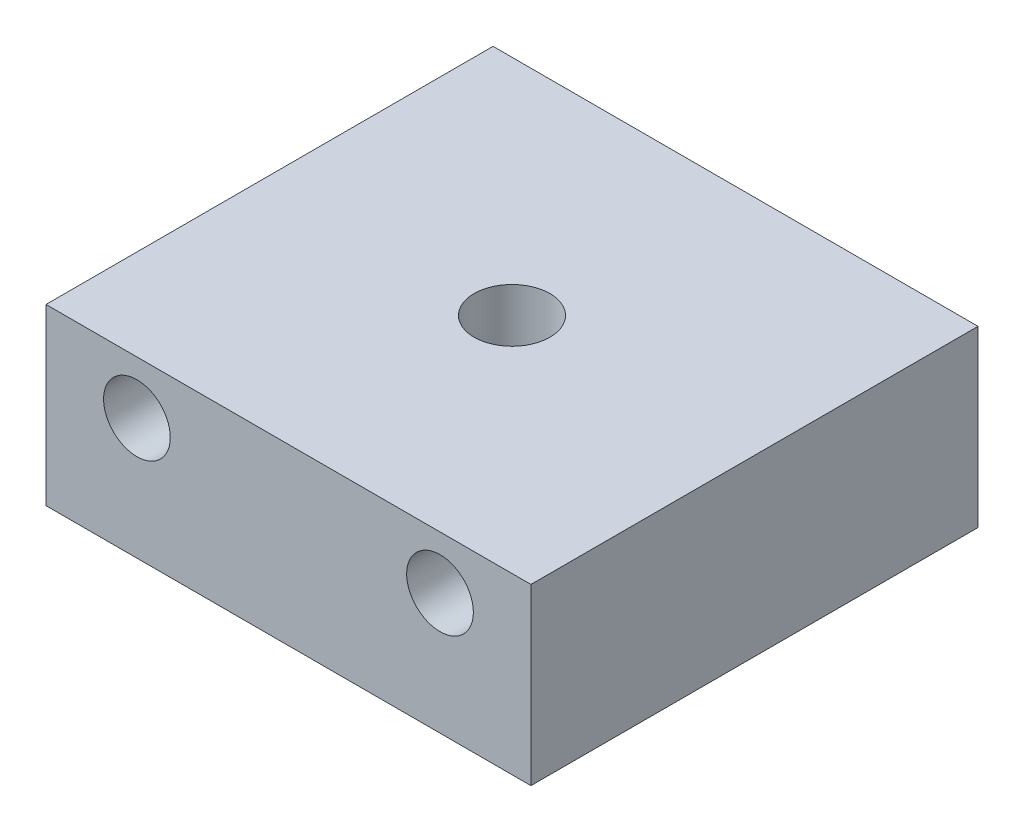
ISO-10303-21;
HEADER;
FILE_DESCRIPTION(('STEP AP214'),'2;1');
FILE_NAME('part.step','',(''),(''),'','','');
FILE_SCHEMA(('AUTOMOTIVE_DESIGN { 1 0 10303 214 1 1 1 1 }'));
ENDSEC;
DATA;
#1=APPLICATION_CONTEXT('core data for automotive mechanical design processes');
#2=APPLICATION_PROTOCOL_DEFINITION('international standard','automotive_design',2000,#1);
#3=PRODUCT_CONTEXT('',#1,'mechanical');
#4=PRODUCT('Part','Part','',(#3));
#5=PRODUCT_RELATED_PRODUCT_CATEGORY('part','',(#4));
#6=PRODUCT_DEFINITION_FORMATION('','',#4);
#7=PRODUCT_DEFINITION_CONTEXT('part definition',#1,'design');
#8=PRODUCT_DEFINITION('design','',#6,#7);
#9=PRODUCT_DEFINITION_SHAPE('','',#8);
#10=(LENGTH_UNIT() NAMED_UNIT(*) SI_UNIT(.MILLI.,.METRE.));
#11=(NAMED_UNIT(*) PLANE_ANGLE_UNIT() SI_UNIT($,.RADIAN.));
#12=(NAMED_UNIT(*) SI_UNIT($,.STERADIAN.) SOLID_ANGLE_UNIT());
#13=UNCERTAINTY_MEASURE_WITH_UNIT(LENGTH_MEASURE(1.E-05),#10,'distance_accuracy_value','');
#14=(GEOMETRIC_REPRESENTATION_CONTEXT(3) GLOBAL_UNCERTAINTY_ASSIGNED_CONTEXT((#13)) GLOBAL_UNIT_ASSIGNED_CONTEXT((#10,
#11,#12)) REPRESENTATION_CONTEXT('',''));
#15=CARTESIAN_POINT('',(0.,0.,0.));
#16=DIRECTION('',(0.,0.,1.));
#17=DIRECTION('',(1.,0.,0.));
#18=AXIS2_PLACEMENT_3D('',#15,#16,#17);
#19=CARTESIAN_POINT('',(0.,0.,29.5));
#20=DIRECTION('',(0.,0.,-1.));
#21=DIRECTION('',(-1.,0.,0.));
#22=AXIS2_PLACEMENT_3D('',#19,#20,#21);
#23=PLANE('',#22);
#24=DIRECTION('',(0.,-1.,0.));
#25=VECTOR('',#24,1.);
#26=CARTESIAN_POINT('',(2.00000000001407,-49.7400000000227,29.5));
#27=LINE('',#26,#25);
#28=CARTESIAN_POINT('',(2.00000000001407,-38.2399999999932,29.5));
#29=VERTEX_POINT('',#28);
#30=CARTESIAN_POINT('',(2.00000000001407,-49.7400000000227,29.5));
#31=VERTEX_POINT('',#30);
#32=EDGE_CURVE('E88',#29,#31,#27,.T.);
#33=ORIENTED_EDGE('',*,*,#32,.T.);
#34=DIRECTION('',(1.,0.,0.));
#35=VECTOR('',#34,1.);
#36=CARTESIAN_POINT('',(2.00000000001407,-49.7400000000227,29.5));
#37=LINE('',#36,#35);
#38=CARTESIAN_POINT('',(33.9999998897534,-49.7400000000227,29.5));
#39=VERTEX_POINT('',#38);
#40=EDGE_CURVE('E83',#31,#39,#37,.T.);
#41=ORIENTED_EDGE('',*,*,#40,.T.);
#42=DIRECTION('',(0.,1.,0.));
#43=VECTOR('',#42,1.);
#44=CARTESIAN_POINT('',(33.9999998897534,-49.7400000000227,29.5));
#45=LINE('',#44,#43);
#46=CARTESIAN_POINT('',(33.9999998897534,-38.2399999999932,29.5));
#47=VERTEX_POINT('',#46);
#48=EDGE_CURVE('E86',#39,#47,#45,.T.);
#49=ORIENTED_EDGE('',*,*,#48,.T.);
#50=DIRECTION('',(-1.,0.,0.));
#51=VECTOR('',#50,1.);
#52=CARTESIAN_POINT('',(2.00000000001407,-38.2399999999932,29.5));
#53=LINE('',#52,#51);
#54=EDGE_CURVE('E53',#47,#29,#53,.T.);
#55=ORIENTED_EDGE('',*,*,#54,.T.);
#56=EDGE_LOOP('',(#33,#41,#49,#55));
#57=FACE_BOUND('',#56,.T.);
#58=CARTESIAN_POINT('',(8.00000000001407,-41.7399999999932,29.5));
#59=DIRECTION('',(0.,0.,1.));
#60=DIRECTION('',(1.,0.,0.));
#61=AXIS2_PLACEMENT_3D('',#58,#59,#60);
#62=CIRCLE('',#61,2.2);
#63=CARTESIAN_POINT('',(10.2000000000141,-41.7399999999932,29.5));
#64=VERTEX_POINT('',#63);
#65=EDGE_CURVE('E104',#64,#64,#62,.T.);
#66=ORIENTED_EDGE('',*,*,#65,.F.);
#67=EDGE_LOOP('',(#66));
#68=FACE_BOUND('',#67,.T.);
#69=CARTESIAN_POINT('',(27.9999998897534,-41.73789989831,29.5));
#70=DIRECTION('',(0.,0.,1.));
#71=DIRECTION('',(1.,0.,0.));
#72=AXIS2_PLACEMENT_3D('',#69,#70,#71);
#73=CIRCLE('',#72,2.2);
#74=CARTESIAN_POINT('',(30.1999998897534,-41.73789989831,29.5));
#75=VERTEX_POINT('',#74);
#76=EDGE_CURVE('E119',#75,#75,#73,.T.);
#77=ORIENTED_EDGE('',*,*,#76,.F.);
#78=EDGE_LOOP('',(#77));
#79=FACE_BOUND('',#78,.T.);
#80=ADVANCED_FACE('F35',(#57,#68,#79),#23,.F.);
#81=CARTESIAN_POINT('',(0.,0.,0.));
#82=DIRECTION('',(0.,0.,-1.));
#83=DIRECTION('',(-1.,0.,0.));
#84=AXIS2_PLACEMENT_3D('',#81,#82,#83);
#85=PLANE('',#84);
#86=CARTESIAN_POINT('',(8.00000000001407,-41.7399999999932,0.));
#87=DIRECTION('',(0.,0.,1.));
#88=DIRECTION('',(1.,0.,0.));
#89=AXIS2_PLACEMENT_3D('',#86,#87,#88);
#90=CIRCLE('',#89,2.2);
#91=CARTESIAN_POINT('',(10.2000000000141,-41.7399999999932,0.));
#92=VERTEX_POINT('',#91);
#93=EDGE_CURVE('E116',#92,#92,#90,.T.);
#94=ORIENTED_EDGE('',*,*,#93,.T.);
#95=EDGE_LOOP('',(#94));
#96=FACE_BOUND('',#95,.T.);
#97=DIRECTION('',(0.,-1.,0.));
#98=VECTOR('',#97,1.);
#99=CARTESIAN_POINT('',(2.00000000001407,-49.7400000000227,0.));
#100=LINE('',#99,#98);
#101=CARTESIAN_POINT('',(2.00000000001407,-38.2399999999932,0.));
#102=VERTEX_POINT('',#101);
#103=CARTESIAN_POINT('',(2.00000000001407,-49.7400000000227,0.));
#104=VERTEX_POINT('',#103);
#105=EDGE_CURVE('E101',#102,#104,#100,.T.);
#106=ORIENTED_EDGE('',*,*,#105,.F.);
#107=DIRECTION('',(-1.,0.,0.));
#108=VECTOR('',#107,1.);
#109=CARTESIAN_POINT('',(2.00000000001407,-38.2399999999932,0.));
#110=LINE('',#109,#108);
#111=CARTESIAN_POINT('',(33.9999998897534,-38.2399999999932,0.));
#112=VERTEX_POINT('',#111);
#113=EDGE_CURVE('E76',#112,#102,#110,.T.);
#114=ORIENTED_EDGE('',*,*,#113,.F.);
#115=DIRECTION('',(0.,1.,0.));
#116=VECTOR('',#115,1.);
#117=CARTESIAN_POINT('',(33.9999998897534,-49.7400000000227,0.));
#118=LINE('',#117,#116);
#119=CARTESIAN_POINT('',(33.9999998897534,-49.7400000000227,0.));
#120=VERTEX_POINT('',#119);
#121=EDGE_CURVE('E70',#120,#112,#118,.T.);
#122=ORIENTED_EDGE('',*,*,#121,.F.);
#123=DIRECTION('',(1.,0.,0.));
#124=VECTOR('',#123,1.);
#125=CARTESIAN_POINT('',(2.00000000001407,-49.7400000000227,0.));
#126=LINE('',#125,#124);
#127=EDGE_CURVE('E92',#104,#120,#126,.T.);
#128=ORIENTED_EDGE('',*,*,#127,.F.);
#129=EDGE_LOOP('',(#106,#114,#122,#128));
#130=FACE_BOUND('',#129,.T.);
#131=CARTESIAN_POINT('',(27.9999998897534,-41.73789989831,0.));
#132=DIRECTION('',(0.,0.,1.));
#133=DIRECTION('',(1.,0.,0.));
#134=AXIS2_PLACEMENT_3D('',#131,#132,#133);
#135=CIRCLE('',#134,2.2);
#136=CARTESIAN_POINT('',(30.1999998897534,-41.73789989831,0.));
#137=VERTEX_POINT('',#136);
#138=EDGE_CURVE('E122',#137,#137,#135,.T.);
#139=ORIENTED_EDGE('',*,*,#138,.T.);
#140=EDGE_LOOP('',(#139));
#141=FACE_BOUND('',#140,.T.);
#142=ADVANCED_FACE('F112',(#96,#130,#141),#85,.T.);
#143=CARTESIAN_POINT('',(2.00000000001407,-49.7400000000227,29.5));
#144=DIRECTION('',(1.,0.,0.));
#145=DIRECTION('',(0.,1.,0.));
#146=AXIS2_PLACEMENT_3D('',#143,#144,#145);
#147=PLANE('',#146);
#148=ORIENTED_EDGE('',*,*,#105,.T.);
#149=DIRECTION('',(0.,0.,-1.));
#150=VECTOR('',#149,1.);
#151=CARTESIAN_POINT('',(2.00000000001407,-49.7400000000227,29.5));
#152=LINE('',#151,#150);
#153=EDGE_CURVE('E11',#31,#104,#152,.T.);
#154=ORIENTED_EDGE('',*,*,#153,.F.);
#155=ORIENTED_EDGE('',*,*,#32,.F.);
#156=DIRECTION('',(0.,0.,-1.));
#157=VECTOR('',#156,1.);
#158=CARTESIAN_POINT('',(2.00000000001407,-38.2399999999932,29.5));
#159=LINE('',#158,#157);
#160=EDGE_CURVE('E97',#29,#102,#159,.T.);
#161=ORIENTED_EDGE('',*,*,#160,.T.);
#162=EDGE_LOOP('',(#148,#154,#155,#161));
#163=FACE_BOUND('',#162,.T.);
#164=ADVANCED_FACE('F37',(#163),#147,.F.);
#165=CARTESIAN_POINT('',(2.00000000001407,-49.7400000000227,29.5));
#166=DIRECTION('',(0.,1.,0.));
#167=DIRECTION('',(0.,0.,1.));
#168=AXIS2_PLACEMENT_3D('',#165,#166,#167);
#169=PLANE('',#168);
#170=CARTESIAN_POINT('',(17.9999999448837,-49.7400000000227,14.75));
#171=DIRECTION('',(0.,-1.,0.));
#172=DIRECTION('',(0.,0.,-1.));
#173=AXIS2_PLACEMENT_3D('',#170,#171,#172);
#174=CIRCLE('',#173,2.5);
#175=CARTESIAN_POINT('',(17.9999999448837,-49.7400000000227,12.25));
#176=VERTEX_POINT('',#175);
#177=EDGE_CURVE('E127',#176,#176,#174,.T.);
#178=ORIENTED_EDGE('',*,*,#177,.F.);
#179=EDGE_LOOP('',(#178));
#180=FACE_BOUND('',#179,.T.);
#181=ORIENTED_EDGE('',*,*,#127,.T.);
#182=DIRECTION('',(0.,0.,-1.));
#183=VECTOR('',#182,1.);
#184=CARTESIAN_POINT('',(33.9999998897534,-49.7400000000227,29.5));
#185=LINE('',#184,#183);
#186=EDGE_CURVE('E45',#39,#120,#185,.T.);
#187=ORIENTED_EDGE('',*,*,#186,.F.);
#188=ORIENTED_EDGE('',*,*,#40,.F.);
#189=ORIENTED_EDGE('',*,*,#153,.T.);
#190=EDGE_LOOP('',(#181,#187,#188,#189));
#191=FACE_BOUND('',#190,.T.);
#192=ADVANCED_FACE('F91',(#180,#191),#169,.F.);
#193=CARTESIAN_POINT('',(33.9999998897534,-49.7400000000227,29.5));
#194=DIRECTION('',(-1.,0.,0.));
#195=DIRECTION('',(0.,0.,1.));
#196=AXIS2_PLACEMENT_3D('',#193,#194,#195);
#197=PLANE('',#196);
#198=ORIENTED_EDGE('',*,*,#121,.T.);
#199=DIRECTION('',(0.,0.,-1.));
#200=VECTOR('',#199,1.);
#201=CARTESIAN_POINT('',(33.9999998897534,-38.2399999999932,29.5));
#202=LINE('',#201,#200);
#203=EDGE_CURVE('E93',#47,#112,#202,.T.);
#204=ORIENTED_EDGE('',*,*,#203,.F.);
#205=ORIENTED_EDGE('',*,*,#48,.F.);
#206=ORIENTED_EDGE('',*,*,#186,.T.);
#207=EDGE_LOOP('',(#198,#204,#205,#206));
#208=FACE_BOUND('',#207,.T.);
#209=ADVANCED_FACE('F95',(#208),#197,.F.);
#210=CARTESIAN_POINT('',(2.00000000001407,-38.2399999999932,29.5));
#211=DIRECTION('',(0.,-1.,0.));
#212=DIRECTION('',(0.,0.,-1.));
#213=AXIS2_PLACEMENT_3D('',#210,#211,#212);
#214=PLANE('',#213);
#215=CARTESIAN_POINT('',(17.9999999448837,-38.2399999999932,14.75));
#216=DIRECTION('',(0.,-1.,0.));
#217=DIRECTION('',(0.,0.,-1.));
#218=AXIS2_PLACEMENT_3D('',#215,#216,#217);
#219=CIRCLE('',#218,2.5);
#220=CARTESIAN_POINT('',(17.9999999448837,-38.2399999999932,12.25));
#221=VERTEX_POINT('',#220);
#222=EDGE_CURVE('E39',#221,#221,#219,.T.);
#223=ORIENTED_EDGE('',*,*,#222,.T.);
#224=EDGE_LOOP('',(#223));
#225=FACE_BOUND('',#224,.T.);
#226=ORIENTED_EDGE('',*,*,#113,.T.);
#227=ORIENTED_EDGE('',*,*,#160,.F.);
#228=ORIENTED_EDGE('',*,*,#54,.F.);
#229=ORIENTED_EDGE('',*,*,#203,.T.);
#230=EDGE_LOOP('',(#226,#227,#228,#229));
#231=FACE_BOUND('',#230,.T.);
#232=ADVANCED_FACE('F109',(#225,#231),#214,.F.);
#233=CARTESIAN_POINT('',(8.00000000001407,-41.7399999999932,29.5));
#234=DIRECTION('',(0.,0.,-1.));
#235=DIRECTION('',(-1.,0.,0.));
#236=AXIS2_PLACEMENT_3D('',#233,#234,#235);
#237=CYLINDRICAL_SURFACE('',#236,2.2);
#238=ORIENTED_EDGE('',*,*,#65,.T.);
#239=EDGE_LOOP('',(#238));
#240=FACE_BOUND('',#239,.T.);
#241=ORIENTED_EDGE('',*,*,#93,.F.);
#242=EDGE_LOOP('',(#241));
#243=FACE_BOUND('',#242,.T.);
#244=ADVANCED_FACE('F142',(#240,#243),#237,.F.);
#245=CARTESIAN_POINT('',(27.9999998897534,-41.73789989831,29.5));
#246=DIRECTION('',(0.,0.,-1.));
#247=DIRECTION('',(-1.,0.,0.));
#248=AXIS2_PLACEMENT_3D('',#245,#246,#247);
#249=CYLINDRICAL_SURFACE('',#248,2.2);
#250=ORIENTED_EDGE('',*,*,#76,.T.);
#251=EDGE_LOOP('',(#250));
#252=FACE_BOUND('',#251,.T.);
#253=ORIENTED_EDGE('',*,*,#138,.F.);
#254=EDGE_LOOP('',(#253));
#255=FACE_BOUND('',#254,.T.);
#256=ADVANCED_FACE('F137',(#252,#255),#249,.F.);
#257=CARTESIAN_POINT('',(17.9999999448837,-20.2400000000227,14.75));
#258=DIRECTION('',(0.,-1.,0.));
#259=DIRECTION('',(0.,0.,-1.));
#260=AXIS2_PLACEMENT_3D('',#257,#258,#259);
#261=CYLINDRICAL_SURFACE('',#260,2.5);
#262=ORIENTED_EDGE('',*,*,#177,.T.);
#263=EDGE_LOOP('',(#262));
#264=FACE_BOUND('',#263,.T.);
#265=ORIENTED_EDGE('',*,*,#222,.F.);
#266=EDGE_LOOP('',(#265));
#267=FACE_BOUND('',#266,.T.);
#268=ADVANCED_FACE('F135',(#264,#267),#261,.F.);
#269=CLOSED_SHELL('',(#80,#142,#164,#192,#209,#232,#244,#256,#268));
#270=MANIFOLD_SOLID_BREP('B2',#269);
#271=ADVANCED_BREP_SHAPE_REPRESENTATION('',(#18,#270),#14);
#272=SHAPE_DEFINITION_REPRESENTATION(#9,#271);
ENDSEC;
END-ISO-10303-21;
